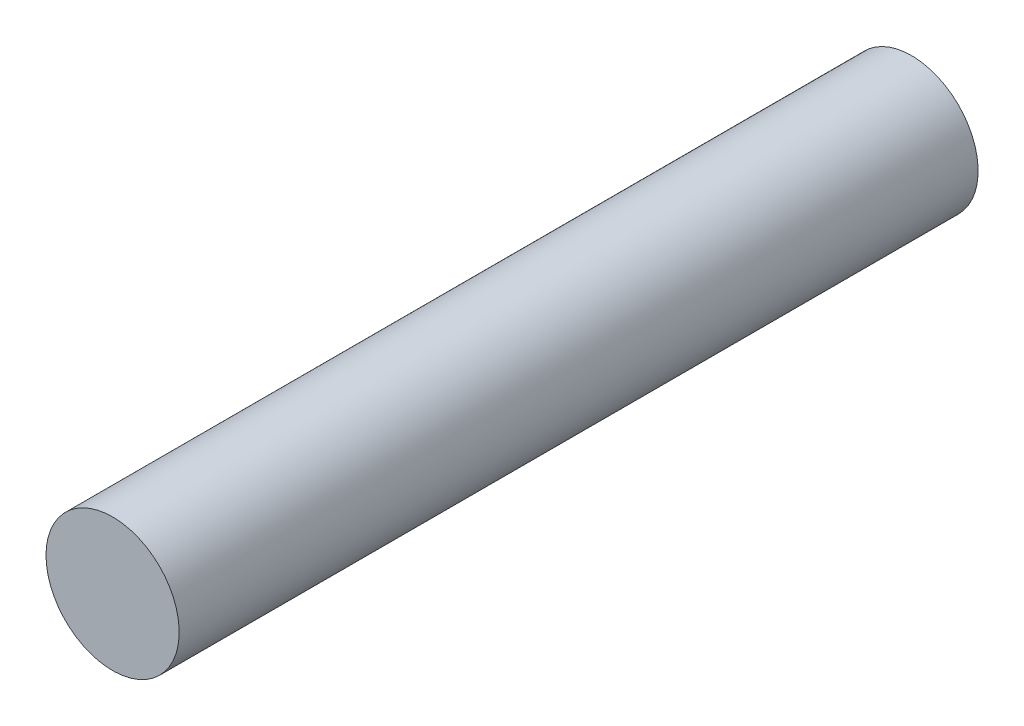
ISO-10303-21;
HEADER;
FILE_DESCRIPTION(('STEP AP214'),'2;1');
FILE_NAME('part.step','',(''),(''),'','','');
FILE_SCHEMA(('AUTOMOTIVE_DESIGN { 1 0 10303 214 1 1 1 1 }'));
ENDSEC;
DATA;
#1=APPLICATION_CONTEXT('core data for automotive mechanical design processes');
#2=APPLICATION_PROTOCOL_DEFINITION('international standard','automotive_design',2000,#1);
#3=PRODUCT_CONTEXT('',#1,'mechanical');
#4=PRODUCT('Part','Part','',(#3));
#5=PRODUCT_RELATED_PRODUCT_CATEGORY('part','',(#4));
#6=PRODUCT_DEFINITION_FORMATION('','',#4);
#7=PRODUCT_DEFINITION_CONTEXT('part definition',#1,'design');
#8=PRODUCT_DEFINITION('design','',#6,#7);
#9=PRODUCT_DEFINITION_SHAPE('','',#8);
#10=(LENGTH_UNIT() NAMED_UNIT(*) SI_UNIT(.MILLI.,.METRE.));
#11=(NAMED_UNIT(*) PLANE_ANGLE_UNIT() SI_UNIT($,.RADIAN.));
#12=(NAMED_UNIT(*) SI_UNIT($,.STERADIAN.) SOLID_ANGLE_UNIT());
#13=UNCERTAINTY_MEASURE_WITH_UNIT(LENGTH_MEASURE(1.E-05),#10,'distance_accuracy_value','');
#14=(GEOMETRIC_REPRESENTATION_CONTEXT(3) GLOBAL_UNCERTAINTY_ASSIGNED_CONTEXT((#13)) GLOBAL_UNIT_ASSIGNED_CONTEXT((#10,
#11,#12)) REPRESENTATION_CONTEXT('',''));
#15=CARTESIAN_POINT('',(0.,0.,0.));
#16=DIRECTION('',(0.,0.,1.));
#17=DIRECTION('',(1.,0.,0.));
#18=AXIS2_PLACEMENT_3D('',#15,#16,#17);
#19=CARTESIAN_POINT('',(0.,0.,19.05));
#20=DIRECTION('',(0.,0.,-1.));
#21=DIRECTION('',(-1.,0.,0.));
#22=AXIS2_PLACEMENT_3D('',#19,#20,#21);
#23=CYLINDRICAL_SURFACE('',#22,1.5875);
#24=CARTESIAN_POINT('',(0.,0.,19.05));
#25=DIRECTION('',(0.,0.,1.));
#26=DIRECTION('',(1.,0.,0.));
#27=AXIS2_PLACEMENT_3D('',#24,#25,#26);
#28=CIRCLE('',#27,1.5875);
#29=CARTESIAN_POINT('',(-1.5875,0.,19.05));
#30=VERTEX_POINT('',#29);
#31=EDGE_CURVE('E10',#30,#30,#28,.T.);
#32=CARTESIAN_POINT('',(0.,0.,0.));
#33=DIRECTION('',(0.,0.,1.));
#34=DIRECTION('',(1.,0.,0.));
#35=AXIS2_PLACEMENT_3D('',#32,#33,#34);
#36=CIRCLE('',#35,1.5875);
#37=CARTESIAN_POINT('',(-1.5875,0.,0.));
#38=VERTEX_POINT('',#37);
#39=EDGE_CURVE('E34',#38,#38,#36,.T.);
#40=CARTESIAN_POINT('',(-1.5875,0.,19.05));
#41=CARTESIAN_POINT('',(-1.5875,0.,18.8515625));
#42=CARTESIAN_POINT('',(-1.5875,0.,18.653125));
#43=CARTESIAN_POINT('',(-1.5875,0.,18.25625));
#44=CARTESIAN_POINT('',(-1.5875,0.,18.0578125));
#45=CARTESIAN_POINT('',(-1.5875,0.,17.6609375));
#46=CARTESIAN_POINT('',(-1.5875,0.,17.4625));
#47=CARTESIAN_POINT('',(-1.5875,0.,17.065625));
#48=CARTESIAN_POINT('',(-1.5875,0.,16.8671875));
#49=CARTESIAN_POINT('',(-1.5875,0.,16.4703125));
#50=CARTESIAN_POINT('',(-1.5875,0.,16.271875));
#51=CARTESIAN_POINT('',(-1.5875,0.,15.875));
#52=CARTESIAN_POINT('',(-1.5875,0.,15.6765625));
#53=CARTESIAN_POINT('',(-1.5875,0.,15.2796875));
#54=CARTESIAN_POINT('',(-1.5875,0.,15.08125));
#55=CARTESIAN_POINT('',(-1.5875,0.,14.684375));
#56=CARTESIAN_POINT('',(-1.5875,0.,14.4859375));
#57=CARTESIAN_POINT('',(-1.5875,0.,14.0890625));
#58=CARTESIAN_POINT('',(-1.5875,0.,13.890625));
#59=CARTESIAN_POINT('',(-1.5875,0.,13.49375));
#60=CARTESIAN_POINT('',(-1.5875,0.,13.2953125));
#61=CARTESIAN_POINT('',(-1.5875,0.,12.8984375));
#62=CARTESIAN_POINT('',(-1.5875,0.,12.7));
#63=CARTESIAN_POINT('',(-1.5875,0.,12.303125));
#64=CARTESIAN_POINT('',(-1.5875,0.,12.1046875));
#65=CARTESIAN_POINT('',(-1.5875,0.,11.7078125));
#66=CARTESIAN_POINT('',(-1.5875,0.,11.509375));
#67=CARTESIAN_POINT('',(-1.5875,0.,11.1125));
#68=CARTESIAN_POINT('',(-1.5875,0.,10.9140625));
#69=CARTESIAN_POINT('',(-1.5875,0.,10.5171875));
#70=CARTESIAN_POINT('',(-1.5875,0.,10.31875));
#71=CARTESIAN_POINT('',(-1.5875,0.,9.921875));
#72=CARTESIAN_POINT('',(-1.5875,0.,9.7234375));
#73=CARTESIAN_POINT('',(-1.5875,0.,9.3265625));
#74=CARTESIAN_POINT('',(-1.5875,0.,9.128125));
#75=CARTESIAN_POINT('',(-1.5875,0.,8.73125));
#76=CARTESIAN_POINT('',(-1.5875,0.,8.5328125));
#77=CARTESIAN_POINT('',(-1.5875,0.,8.1359375));
#78=CARTESIAN_POINT('',(-1.5875,0.,7.9375));
#79=CARTESIAN_POINT('',(-1.5875,0.,7.540625));
#80=CARTESIAN_POINT('',(-1.5875,0.,7.3421875));
#81=CARTESIAN_POINT('',(-1.5875,0.,6.9453125));
#82=CARTESIAN_POINT('',(-1.5875,0.,6.746875));
#83=CARTESIAN_POINT('',(-1.5875,0.,6.35));
#84=CARTESIAN_POINT('',(-1.5875,0.,6.1515625));
#85=CARTESIAN_POINT('',(-1.5875,0.,5.7546875));
#86=CARTESIAN_POINT('',(-1.5875,0.,5.55625));
#87=CARTESIAN_POINT('',(-1.5875,0.,5.159375));
#88=CARTESIAN_POINT('',(-1.5875,0.,4.9609375));
#89=CARTESIAN_POINT('',(-1.5875,0.,4.5640625));
#90=CARTESIAN_POINT('',(-1.5875,0.,4.365625));
#91=CARTESIAN_POINT('',(-1.5875,0.,3.96875));
#92=CARTESIAN_POINT('',(-1.5875,0.,3.7703125));
#93=CARTESIAN_POINT('',(-1.5875,0.,3.3734375));
#94=CARTESIAN_POINT('',(-1.5875,0.,3.175));
#95=CARTESIAN_POINT('',(-1.5875,0.,2.778125));
#96=CARTESIAN_POINT('',(-1.5875,0.,2.5796875));
#97=CARTESIAN_POINT('',(-1.5875,0.,2.1828125));
#98=CARTESIAN_POINT('',(-1.5875,0.,1.984375));
#99=CARTESIAN_POINT('',(-1.5875,0.,1.5875));
#100=CARTESIAN_POINT('',(-1.5875,0.,1.3890625));
#101=CARTESIAN_POINT('',(-1.5875,0.,0.992187500000001));
#102=CARTESIAN_POINT('',(-1.5875,0.,0.793750000000001));
#103=CARTESIAN_POINT('',(-1.5875,0.,0.396875));
#104=CARTESIAN_POINT('',(-1.5875,0.,0.1984375));
#105=CARTESIAN_POINT('',(-1.5875,0.,0.));
#106=B_SPLINE_CURVE_WITH_KNOTS('',3,(#40,#41,#42,#43,#44,#45,#46,#47,#48,#49,#50,#51,#52,#53,
#54,#55,#56,#57,#58,#59,#60,#61,#62,#63,#64,#65,#66,#67,#68,#69,#70,#71,#72,#73,#74,#75,#76,#77,
#78,#79,#80,#81,#82,#83,#84,#85,#86,#87,#88,#89,#90,#91,#92,#93,#94,#95,#96,#97,#98,#99,#100,
#101,#102,#103,#104,#105),.UNSPECIFIED.,.F.,.F.,(4,2,2,2,2,2,2,2,2,2,2,2,2,2,2,2,2,2,2,2,2,2,2,
2,2,2,2,2,2,2,2,2,4),(0.,0.595312499999997,1.190625,1.7859375,2.38125,2.9765625,3.571875,
4.1671875,4.7625,5.3578125,5.953125,6.5484375,7.14375,7.7390625,8.334375,8.9296875,9.525,
10.1203125,10.715625,11.3109375,11.90625,12.5015625,13.096875,13.6921875,14.2875,14.8828125,
15.478125,16.0734375,16.66875,17.2640625,17.859375,18.4546875,19.05),.UNSPECIFIED.);
#107=EDGE_CURVE('BSEAM31',#30,#38,#106,.T.);
#108=ORIENTED_EDGE('',*,*,#31,.F.);
#109=ORIENTED_EDGE('',*,*,#39,.T.);
#110=ORIENTED_EDGE('',*,*,#107,.T.);
#111=ORIENTED_EDGE('',*,*,#107,.F.);
#112=EDGE_LOOP('',(#108,#110,#109,#111));
#113=FACE_BOUND('',#112,.T.);
#114=ADVANCED_FACE('F31',(#113),#23,.T.);
#115=CARTESIAN_POINT('',(0.,0.,19.05));
#116=DIRECTION('',(0.,0.,1.));
#117=DIRECTION('',(1.,0.,0.));
#118=AXIS2_PLACEMENT_3D('',#115,#116,#117);
#119=PLANE('',#118);
#120=ORIENTED_EDGE('',*,*,#31,.T.);
#121=EDGE_LOOP('',(#120));
#122=FACE_BOUND('',#121,.T.);
#123=ADVANCED_FACE('F46',(#122),#119,.T.);
#124=CARTESIAN_POINT('',(0.,0.,0.));
#125=DIRECTION('',(0.,0.,1.));
#126=DIRECTION('',(1.,0.,0.));
#127=AXIS2_PLACEMENT_3D('',#124,#125,#126);
#128=PLANE('',#127);
#129=ORIENTED_EDGE('',*,*,#39,.F.);
#130=EDGE_LOOP('',(#129));
#131=FACE_BOUND('',#130,.T.);
#132=ADVANCED_FACE('F44',(#131),#128,.F.);
#133=CLOSED_SHELL('',(#114,#123,#132));
#134=MANIFOLD_SOLID_BREP('B2',#133);
#135=ADVANCED_BREP_SHAPE_REPRESENTATION('',(#18,#134),#14);
#136=SHAPE_DEFINITION_REPRESENTATION(#9,#135);
ENDSEC;
END-ISO-10303-21;
